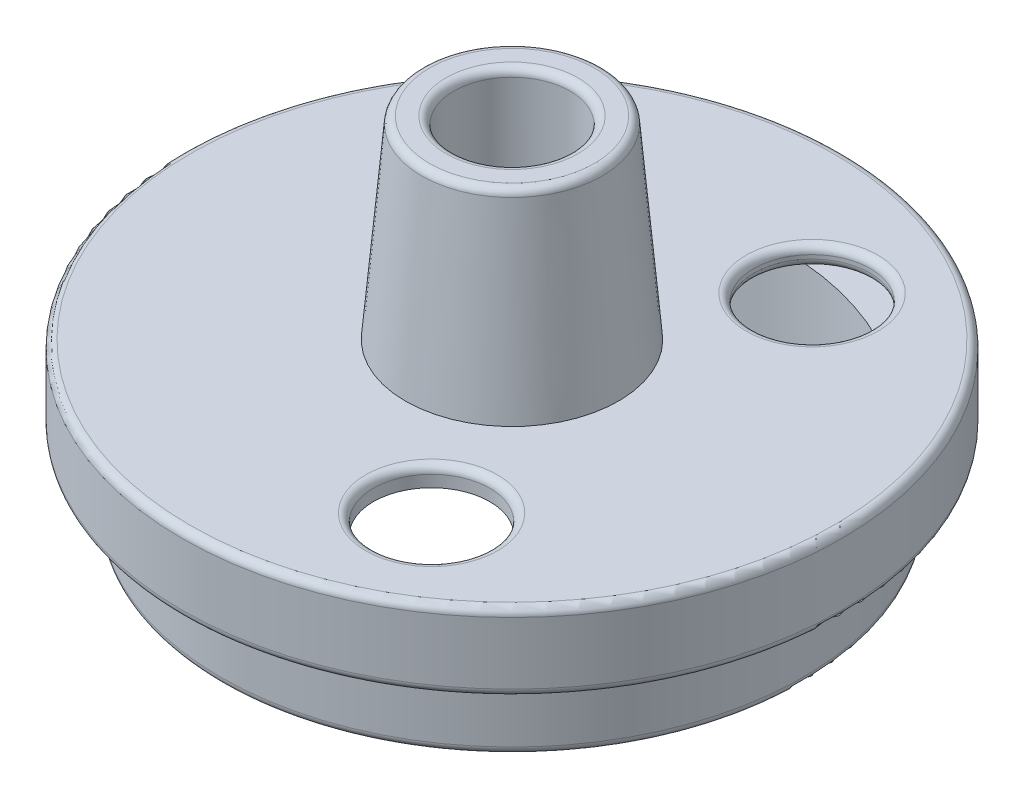
ISO-10303-21;
HEADER;
FILE_DESCRIPTION(('STEP AP214'),'2;1');
FILE_NAME('part.step','',(''),(''),'','','');
FILE_SCHEMA(('AUTOMOTIVE_DESIGN { 1 0 10303 214 1 1 1 1 }'));
ENDSEC;
DATA;
#1=APPLICATION_CONTEXT('core data for automotive mechanical design processes');
#2=APPLICATION_PROTOCOL_DEFINITION('international standard','automotive_design',2000,#1);
#3=PRODUCT_CONTEXT('',#1,'mechanical');
#4=PRODUCT('Part','Part','',(#3));
#5=PRODUCT_RELATED_PRODUCT_CATEGORY('part','',(#4));
#6=PRODUCT_DEFINITION_FORMATION('','',#4);
#7=PRODUCT_DEFINITION_CONTEXT('part definition',#1,'design');
#8=PRODUCT_DEFINITION('design','',#6,#7);
#9=PRODUCT_DEFINITION_SHAPE('','',#8);
#10=(LENGTH_UNIT() NAMED_UNIT(*) SI_UNIT(.MILLI.,.METRE.));
#11=(NAMED_UNIT(*) PLANE_ANGLE_UNIT() SI_UNIT($,.RADIAN.));
#12=(NAMED_UNIT(*) SI_UNIT($,.STERADIAN.) SOLID_ANGLE_UNIT());
#13=UNCERTAINTY_MEASURE_WITH_UNIT(LENGTH_MEASURE(1.E-05),#10,'distance_accuracy_value','');
#14=(GEOMETRIC_REPRESENTATION_CONTEXT(3) GLOBAL_UNCERTAINTY_ASSIGNED_CONTEXT((#13)) GLOBAL_UNIT_ASSIGNED_CONTEXT((#10,
#11,#12)) REPRESENTATION_CONTEXT('',''));
#15=CARTESIAN_POINT('',(0.,0.,0.));
#16=DIRECTION('',(0.,0.,1.));
#17=DIRECTION('',(1.,0.,0.));
#18=AXIS2_PLACEMENT_3D('',#15,#16,#17);
#19=CARTESIAN_POINT('',(0.,0.,0.));
#20=DIRECTION('',(0.,1.,0.));
#21=DIRECTION('',(0.,0.,1.));
#22=AXIS2_PLACEMENT_3D('',#19,#20,#21);
#23=PLANE('',#22);
#24=CARTESIAN_POINT('',(2.83333333333334,0.,4.90747728811181));
#25=DIRECTION('',(0.,1.,0.));
#26=DIRECTION('',(0.,0.,1.));
#27=AXIS2_PLACEMENT_3D('',#24,#25,#26);
#28=CIRCLE('',#27,1.7);
#29=CARTESIAN_POINT('',(2.83333333333334,0.,6.60747728811181));
#30=VERTEX_POINT('',#29);
#31=EDGE_CURVE('E83',#30,#30,#28,.F.);
#32=ORIENTED_EDGE('',*,*,#31,.T.);
#33=EDGE_LOOP('',(#32));
#34=FACE_BOUND('',#33,.T.);
#35=CARTESIAN_POINT('',(2.8333333333333,0.,-4.90747728811184));
#36=DIRECTION('',(0.,1.,0.));
#37=DIRECTION('',(0.,0.,1.));
#38=AXIS2_PLACEMENT_3D('',#35,#36,#37);
#39=CIRCLE('',#38,1.7);
#40=CARTESIAN_POINT('',(2.8333333333333,0.,-3.20747728811184));
#41=VERTEX_POINT('',#40);
#42=EDGE_CURVE('E86',#41,#41,#39,.F.);
#43=ORIENTED_EDGE('',*,*,#42,.T.);
#44=EDGE_LOOP('',(#43));
#45=FACE_BOUND('',#44,.T.);
#46=CARTESIAN_POINT('',(0.,0.,0.));
#47=DIRECTION('',(0.,1.,0.));
#48=DIRECTION('',(0.,0.,1.));
#49=AXIS2_PLACEMENT_3D('',#46,#47,#48);
#50=CIRCLE('',#49,8.3);
#51=CARTESIAN_POINT('',(0.,0.,8.3));
#52=VERTEX_POINT('',#51);
#53=EDGE_CURVE('E89',#52,#52,#50,.T.);
#54=ORIENTED_EDGE('',*,*,#53,.T.);
#55=EDGE_LOOP('',(#54));
#56=FACE_BOUND('',#55,.T.);
#57=CARTESIAN_POINT('',(0.,0.,0.));
#58=DIRECTION('',(0.,1.,0.));
#59=DIRECTION('',(0.,0.,1.));
#60=AXIS2_PLACEMENT_3D('',#57,#58,#59);
#61=CIRCLE('',#60,2.75);
#62=CARTESIAN_POINT('',(0.,0.,2.75));
#63=VERTEX_POINT('',#62);
#64=EDGE_CURVE('E113',#63,#63,#61,.T.);
#65=ORIENTED_EDGE('',*,*,#64,.F.);
#66=EDGE_LOOP('',(#65));
#67=FACE_BOUND('',#66,.T.);
#68=ADVANCED_FACE('F33',(#34,#45,#56,#67),#23,.T.);
#69=CARTESIAN_POINT('',(0.,0.,0.));
#70=DIRECTION('',(0.,1.,0.));
#71=DIRECTION('',(0.,0.,1.));
#72=AXIS2_PLACEMENT_3D('',#69,#70,#71);
#73=CYLINDRICAL_SURFACE('',#72,8.5);
#74=CARTESIAN_POINT('',(0.,-1.8,0.));
#75=DIRECTION('',(0.,-1.,0.));
#76=DIRECTION('',(0.,0.,-1.));
#77=AXIS2_PLACEMENT_3D('',#74,#75,#76);
#78=CIRCLE('',#77,8.5);
#79=CARTESIAN_POINT('',(0.,-1.8,-8.5));
#80=VERTEX_POINT('',#79);
#81=EDGE_CURVE('E65',#80,#80,#78,.F.);
#82=ORIENTED_EDGE('',*,*,#81,.T.);
#83=EDGE_LOOP('',(#82));
#84=FACE_BOUND('',#83,.T.);
#85=CARTESIAN_POINT('',(0.,-0.2,0.));
#86=DIRECTION('',(0.,1.,0.));
#87=DIRECTION('',(0.,0.,1.));
#88=AXIS2_PLACEMENT_3D('',#85,#86,#87);
#89=CIRCLE('',#88,8.5);
#90=CARTESIAN_POINT('',(0.,-0.200000000000001,8.5));
#91=VERTEX_POINT('',#90);
#92=EDGE_CURVE('E68',#91,#91,#89,.F.);
#93=ORIENTED_EDGE('',*,*,#92,.T.);
#94=EDGE_LOOP('',(#93));
#95=FACE_BOUND('',#94,.T.);
#96=ADVANCED_FACE('F120',(#84,#95),#73,.T.);
#97=CARTESIAN_POINT('',(0.,-2.,8.5));
#98=DIRECTION('',(0.,-1.,0.));
#99=DIRECTION('',(0.,0.,-1.));
#100=AXIS2_PLACEMENT_3D('',#97,#98,#99);
#101=PLANE('',#100);
#102=CARTESIAN_POINT('',(0.,-2.,0.));
#103=DIRECTION('',(0.,-1.,0.));
#104=DIRECTION('',(0.,0.,-1.));
#105=AXIS2_PLACEMENT_3D('',#102,#103,#104);
#106=CIRCLE('',#105,8.3);
#107=CARTESIAN_POINT('',(0.,-2.,-8.3));
#108=VERTEX_POINT('',#107);
#109=EDGE_CURVE('E62',#108,#108,#106,.T.);
#110=ORIENTED_EDGE('',*,*,#109,.T.);
#111=EDGE_LOOP('',(#110));
#112=FACE_BOUND('',#111,.T.);
#113=CARTESIAN_POINT('',(0.,-2.,0.));
#114=DIRECTION('',(0.,1.,0.));
#115=DIRECTION('',(0.,0.,1.));
#116=AXIS2_PLACEMENT_3D('',#113,#114,#115);
#117=CIRCLE('',#116,7.5);
#118=CARTESIAN_POINT('',(0.,-2.,7.5));
#119=VERTEX_POINT('',#118);
#120=EDGE_CURVE('E95',#119,#119,#117,.T.);
#121=ORIENTED_EDGE('',*,*,#120,.T.);
#122=EDGE_LOOP('',(#121));
#123=FACE_BOUND('',#122,.T.);
#124=ADVANCED_FACE('F126',(#112,#123),#101,.T.);
#125=CARTESIAN_POINT('',(0.,0.,0.));
#126=DIRECTION('',(0.,1.,0.));
#127=DIRECTION('',(0.,0.,1.));
#128=AXIS2_PLACEMENT_3D('',#125,#126,#127);
#129=CYLINDRICAL_SURFACE('',#128,7.5);
#130=CARTESIAN_POINT('',(0.,-3.8,0.));
#131=DIRECTION('',(0.,-1.,0.));
#132=DIRECTION('',(0.,0.,-1.));
#133=AXIS2_PLACEMENT_3D('',#130,#131,#132);
#134=CIRCLE('',#133,7.5);
#135=CARTESIAN_POINT('',(0.,-3.8,-7.5));
#136=VERTEX_POINT('',#135);
#137=EDGE_CURVE('E71',#136,#136,#134,.F.);
#138=ORIENTED_EDGE('',*,*,#137,.T.);
#139=EDGE_LOOP('',(#138));
#140=FACE_BOUND('',#139,.T.);
#141=ORIENTED_EDGE('',*,*,#120,.F.);
#142=EDGE_LOOP('',(#141));
#143=FACE_BOUND('',#142,.T.);
#144=ADVANCED_FACE('F208',(#140,#143),#129,.T.);
#145=CARTESIAN_POINT('',(0.,-4.,7.));
#146=DIRECTION('',(0.,-1.,0.));
#147=DIRECTION('',(0.,0.,-1.));
#148=AXIS2_PLACEMENT_3D('',#145,#146,#147);
#149=PLANE('',#148);
#150=CARTESIAN_POINT('',(0.,-4.,0.));
#151=DIRECTION('',(0.,-1.,0.));
#152=DIRECTION('',(0.,0.,-1.));
#153=AXIS2_PLACEMENT_3D('',#150,#151,#152);
#154=CIRCLE('',#153,7.2);
#155=CARTESIAN_POINT('',(0.,-4.,-7.2));
#156=VERTEX_POINT('',#155);
#157=EDGE_CURVE('E77',#156,#156,#154,.F.);
#158=ORIENTED_EDGE('',*,*,#157,.T.);
#159=EDGE_LOOP('',(#158));
#160=FACE_BOUND('',#159,.T.);
#161=CARTESIAN_POINT('',(0.,-4.,0.));
#162=DIRECTION('',(0.,-1.,0.));
#163=DIRECTION('',(0.,0.,-1.));
#164=AXIS2_PLACEMENT_3D('',#161,#162,#163);
#165=CIRCLE('',#164,7.3);
#166=CARTESIAN_POINT('',(0.,-4.,-7.3));
#167=VERTEX_POINT('',#166);
#168=EDGE_CURVE('E80',#167,#167,#165,.T.);
#169=ORIENTED_EDGE('',*,*,#168,.T.);
#170=EDGE_LOOP('',(#169));
#171=FACE_BOUND('',#170,.T.);
#172=ADVANCED_FACE('F204',(#160,#171),#149,.T.);
#173=CARTESIAN_POINT('',(0.,0.,0.));
#174=DIRECTION('',(0.,1.,0.));
#175=DIRECTION('',(0.,0.,1.));
#176=AXIS2_PLACEMENT_3D('',#173,#174,#175);
#177=CYLINDRICAL_SURFACE('',#176,7.);
#178=CARTESIAN_POINT('',(0.,-3.8,0.));
#179=DIRECTION('',(0.,-1.,0.));
#180=DIRECTION('',(0.,0.,-1.));
#181=AXIS2_PLACEMENT_3D('',#178,#179,#180);
#182=CIRCLE('',#181,7.);
#183=CARTESIAN_POINT('',(0.,-3.8,-7.));
#184=VERTEX_POINT('',#183);
#185=EDGE_CURVE('E74',#184,#184,#182,.T.);
#186=ORIENTED_EDGE('',*,*,#185,.T.);
#187=EDGE_LOOP('',(#186));
#188=FACE_BOUND('',#187,.T.);
#189=CARTESIAN_POINT('',(0.,-1.5,0.));
#190=DIRECTION('',(0.,1.,0.));
#191=DIRECTION('',(0.,0.,1.));
#192=AXIS2_PLACEMENT_3D('',#189,#190,#191);
#193=CIRCLE('',#192,7.);
#194=CARTESIAN_POINT('',(0.,-1.5,7.));
#195=VERTEX_POINT('',#194);
#196=EDGE_CURVE('E98',#195,#195,#193,.T.);
#197=ORIENTED_EDGE('',*,*,#196,.T.);
#198=EDGE_LOOP('',(#197));
#199=FACE_BOUND('',#198,.T.);
#200=ADVANCED_FACE('F200',(#188,#199),#177,.F.);
#201=CARTESIAN_POINT('',(0.,-1.5,8.));
#202=DIRECTION('',(0.,1.,0.));
#203=DIRECTION('',(0.,0.,1.));
#204=AXIS2_PLACEMENT_3D('',#201,#202,#203);
#205=PLANE('',#204);
#206=CARTESIAN_POINT('',(0.,-1.5,0.));
#207=DIRECTION('',(0.,1.,0.));
#208=DIRECTION('',(0.,0.,1.));
#209=AXIS2_PLACEMENT_3D('',#206,#207,#208);
#210=CIRCLE('',#209,8.);
#211=CARTESIAN_POINT('',(0.,-1.5,8.));
#212=VERTEX_POINT('',#211);
#213=EDGE_CURVE('E101',#212,#212,#210,.T.);
#214=ORIENTED_EDGE('',*,*,#213,.T.);
#215=EDGE_LOOP('',(#214));
#216=FACE_BOUND('',#215,.T.);
#217=ORIENTED_EDGE('',*,*,#196,.F.);
#218=EDGE_LOOP('',(#217));
#219=FACE_BOUND('',#218,.T.);
#220=ADVANCED_FACE('F196',(#216,#219),#205,.T.);
#221=CARTESIAN_POINT('',(0.,0.,0.));
#222=DIRECTION('',(0.,1.,0.));
#223=DIRECTION('',(0.,0.,1.));
#224=AXIS2_PLACEMENT_3D('',#221,#222,#223);
#225=CYLINDRICAL_SURFACE('',#224,8.);
#226=CARTESIAN_POINT('',(0.,-0.5,0.));
#227=DIRECTION('',(0.,1.,0.));
#228=DIRECTION('',(0.,0.,1.));
#229=AXIS2_PLACEMENT_3D('',#226,#227,#228);
#230=CIRCLE('',#229,8.);
#231=CARTESIAN_POINT('',(0.,-0.500000000000001,8.));
#232=VERTEX_POINT('',#231);
#233=EDGE_CURVE('E104',#232,#232,#230,.T.);
#234=ORIENTED_EDGE('',*,*,#233,.T.);
#235=EDGE_LOOP('',(#234));
#236=FACE_BOUND('',#235,.T.);
#237=ORIENTED_EDGE('',*,*,#213,.F.);
#238=EDGE_LOOP('',(#237));
#239=FACE_BOUND('',#238,.T.);
#240=ADVANCED_FACE('F192',(#236,#239),#225,.F.);
#241=CARTESIAN_POINT('',(0.,-0.5,0.));
#242=DIRECTION('',(0.,-1.,0.));
#243=DIRECTION('',(0.,0.,-1.));
#244=AXIS2_PLACEMENT_3D('',#241,#242,#243);
#245=PLANE('',#244);
#246=CARTESIAN_POINT('',(2.8333333333333,-0.499999999999999,-4.90747728811184));
#247=DIRECTION('',(0.,-1.,0.));
#248=DIRECTION('',(0.,0.,-1.));
#249=AXIS2_PLACEMENT_3D('',#246,#247,#248);
#250=CIRCLE('',#249,1.7);
#251=CARTESIAN_POINT('',(2.8333333333333,-0.499999999999999,-6.60747728811184));
#252=VERTEX_POINT('',#251);
#253=EDGE_CURVE('E59',#252,#252,#250,.F.);
#254=ORIENTED_EDGE('',*,*,#253,.T.);
#255=EDGE_LOOP('',(#254));
#256=FACE_BOUND('',#255,.T.);
#257=CARTESIAN_POINT('',(2.83333333333334,-0.5,4.90747728811181));
#258=DIRECTION('',(0.,-1.,0.));
#259=DIRECTION('',(0.,0.,-1.));
#260=AXIS2_PLACEMENT_3D('',#257,#258,#259);
#261=CIRCLE('',#260,1.5);
#262=CARTESIAN_POINT('',(2.83333333333334,-0.5,3.40747728811181));
#263=VERTEX_POINT('',#262);
#264=EDGE_CURVE('E110',#263,#263,#261,.F.);
#265=ORIENTED_EDGE('',*,*,#264,.T.);
#266=EDGE_LOOP('',(#265));
#267=FACE_BOUND('',#266,.T.);
#268=CARTESIAN_POINT('',(0.,-0.5,0.));
#269=DIRECTION('',(0.,-1.,0.));
#270=DIRECTION('',(0.,0.,-1.));
#271=AXIS2_PLACEMENT_3D('',#268,#269,#270);
#272=CIRCLE('',#271,1.5);
#273=CARTESIAN_POINT('',(0.,-0.5,-1.5));
#274=VERTEX_POINT('',#273);
#275=EDGE_CURVE('E107',#274,#274,#272,.F.);
#276=ORIENTED_EDGE('',*,*,#275,.T.);
#277=EDGE_LOOP('',(#276));
#278=FACE_BOUND('',#277,.T.);
#279=ORIENTED_EDGE('',*,*,#233,.F.);
#280=EDGE_LOOP('',(#279));
#281=FACE_BOUND('',#280,.T.);
#282=ADVANCED_FACE('F188',(#256,#267,#278,#281),#245,.T.);
#283=CARTESIAN_POINT('',(2.8333333333333,-4.001,-4.90747728811184));
#284=DIRECTION('',(0.,1.,0.));
#285=DIRECTION('',(0.,0.,1.));
#286=AXIS2_PLACEMENT_3D('',#283,#284,#285);
#287=CYLINDRICAL_SURFACE('',#286,1.5);
#288=CARTESIAN_POINT('',(2.8333333333333,-0.299999999999999,-4.90747728811184));
#289=DIRECTION('',(0.,-1.,0.));
#290=DIRECTION('',(0.,0.,-1.));
#291=AXIS2_PLACEMENT_3D('',#288,#289,#290);
#292=CIRCLE('',#291,1.5);
#293=CARTESIAN_POINT('',(2.8333333333333,-0.299999999999999,-6.40747728811184));
#294=VERTEX_POINT('',#293);
#295=EDGE_CURVE('E53',#294,#294,#292,.T.);
#296=ORIENTED_EDGE('',*,*,#295,.T.);
#297=EDGE_LOOP('',(#296));
#298=FACE_BOUND('',#297,.T.);
#299=CARTESIAN_POINT('',(2.8333333333333,-0.2,-4.90747728811184));
#300=DIRECTION('',(0.,1.,0.));
#301=DIRECTION('',(0.,0.,1.));
#302=AXIS2_PLACEMENT_3D('',#299,#300,#301);
#303=CIRCLE('',#302,1.5);
#304=CARTESIAN_POINT('',(2.8333333333333,-0.2,-3.40747728811184));
#305=VERTEX_POINT('',#304);
#306=EDGE_CURVE('E56',#305,#305,#303,.T.);
#307=ORIENTED_EDGE('',*,*,#306,.T.);
#308=EDGE_LOOP('',(#307));
#309=FACE_BOUND('',#308,.T.);
#310=ADVANCED_FACE('F185',(#298,#309),#287,.F.);
#311=CARTESIAN_POINT('',(0.,-4.001,0.));
#312=DIRECTION('',(0.,1.,0.));
#313=DIRECTION('',(0.,0.,1.));
#314=AXIS2_PLACEMENT_3D('',#311,#312,#313);
#315=CYLINDRICAL_SURFACE('',#314,1.5);
#316=CARTESIAN_POINT('',(0.,4.8,0.));
#317=DIRECTION('',(0.,1.,0.));
#318=DIRECTION('',(0.,0.,1.));
#319=AXIS2_PLACEMENT_3D('',#316,#317,#318);
#320=CIRCLE('',#319,1.5);
#321=CARTESIAN_POINT('',(0.,4.8,1.5));
#322=VERTEX_POINT('',#321);
#323=EDGE_CURVE('E10',#322,#322,#320,.T.);
#324=ORIENTED_EDGE('',*,*,#323,.T.);
#325=EDGE_LOOP('',(#324));
#326=FACE_BOUND('',#325,.T.);
#327=ORIENTED_EDGE('',*,*,#275,.F.);
#328=EDGE_LOOP('',(#327));
#329=FACE_BOUND('',#328,.T.);
#330=ADVANCED_FACE('F179',(#326,#329),#315,.F.);
#331=CARTESIAN_POINT('',(2.83333333333334,-4.001,4.90747728811181));
#332=DIRECTION('',(0.,1.,0.));
#333=DIRECTION('',(0.,0.,1.));
#334=AXIS2_PLACEMENT_3D('',#331,#332,#333);
#335=CYLINDRICAL_SURFACE('',#334,1.5);
#336=CARTESIAN_POINT('',(2.83333333333334,-0.200000000000001,4.90747728811181));
#337=DIRECTION('',(0.,1.,0.));
#338=DIRECTION('',(0.,0.,1.));
#339=AXIS2_PLACEMENT_3D('',#336,#337,#338);
#340=CIRCLE('',#339,1.5);
#341=CARTESIAN_POINT('',(2.83333333333334,-0.200000000000001,6.40747728811181));
#342=VERTEX_POINT('',#341);
#343=EDGE_CURVE('E92',#342,#342,#340,.T.);
#344=ORIENTED_EDGE('',*,*,#343,.T.);
#345=EDGE_LOOP('',(#344));
#346=FACE_BOUND('',#345,.T.);
#347=ORIENTED_EDGE('',*,*,#264,.F.);
#348=EDGE_LOOP('',(#347));
#349=FACE_BOUND('',#348,.T.);
#350=ADVANCED_FACE('F173',(#346,#349),#335,.F.);
#351=CARTESIAN_POINT('',(0.,5.,0.));
#352=DIRECTION('',(0.,1.,0.));
#353=DIRECTION('',(0.,0.,1.));
#354=AXIS2_PLACEMENT_3D('',#351,#352,#353);
#355=PLANE('',#354);
#356=CARTESIAN_POINT('',(0.,5.,0.));
#357=DIRECTION('',(0.,1.,0.));
#358=DIRECTION('',(0.,0.,1.));
#359=AXIS2_PLACEMENT_3D('',#356,#357,#358);
#360=CIRCLE('',#359,2.12929044756689);
#361=CARTESIAN_POINT('',(0.,5.,2.12929044756689));
#362=VERTEX_POINT('',#361);
#363=EDGE_CURVE('E44',#362,#362,#360,.T.);
#364=ORIENTED_EDGE('',*,*,#363,.T.);
#365=EDGE_LOOP('',(#364));
#366=FACE_BOUND('',#365,.T.);
#367=CARTESIAN_POINT('',(0.,5.,0.));
#368=DIRECTION('',(0.,1.,0.));
#369=DIRECTION('',(0.,0.,1.));
#370=AXIS2_PLACEMENT_3D('',#367,#368,#369);
#371=CIRCLE('',#370,1.7);
#372=CARTESIAN_POINT('',(0.,5.,1.7));
#373=VERTEX_POINT('',#372);
#374=EDGE_CURVE('E48',#373,#373,#371,.F.);
#375=ORIENTED_EDGE('',*,*,#374,.T.);
#376=EDGE_LOOP('',(#375));
#377=FACE_BOUND('',#376,.T.);
#378=ADVANCED_FACE('F135',(#366,#377),#355,.T.);
#379=CARTESIAN_POINT('',(0.,0.,0.));
#380=DIRECTION('',(0.,-1.,0.));
#381=DIRECTION('',(0.,0.,1.));
#382=AXIS2_PLACEMENT_3D('',#379,#380,#381);
#383=CONICAL_SURFACE('',#382,2.75,0.0872664625997165);
#384=CARTESIAN_POINT('',(0.,4.81743114854953,0.));
#385=DIRECTION('',(0.,-1.,0.));
#386=DIRECTION('',(0.,0.,-1.));
#387=AXIS2_PLACEMENT_3D('',#384,#385,#386);
#388=CIRCLE('',#387,2.32852938718524);
#389=CARTESIAN_POINT('',(0.,4.81743114854953,-2.32852938718524));
#390=VERTEX_POINT('',#389);
#391=EDGE_CURVE('E40',#390,#390,#388,.T.);
#392=ORIENTED_EDGE('',*,*,#391,.T.);
#393=EDGE_LOOP('',(#392));
#394=FACE_BOUND('',#393,.T.);
#395=ORIENTED_EDGE('',*,*,#64,.T.);
#396=EDGE_LOOP('',(#395));
#397=FACE_BOUND('',#396,.T.);
#398=ADVANCED_FACE('F117',(#394,#397),#383,.T.);
#399=CARTESIAN_POINT('',(2.83333333333334,-0.200000000000001,4.90747728811181));
#400=DIRECTION('',(0.,1.,0.));
#401=DIRECTION('',(0.,0.,1.));
#402=AXIS2_PLACEMENT_3D('',#399,#400,#401);
#403=TOROIDAL_SURFACE('',#402,1.7,0.2);
#404=ORIENTED_EDGE('',*,*,#31,.F.);
#405=EDGE_LOOP('',(#404));
#406=FACE_BOUND('',#405,.T.);
#407=ORIENTED_EDGE('',*,*,#343,.F.);
#408=EDGE_LOOP('',(#407));
#409=FACE_BOUND('',#408,.T.);
#410=ADVANCED_FACE('F134',(#406,#409),#403,.T.);
#411=CARTESIAN_POINT('',(0.,-3.8,0.));
#412=DIRECTION('',(0.,-1.,0.));
#413=DIRECTION('',(0.,0.,-1.));
#414=AXIS2_PLACEMENT_3D('',#411,#412,#413);
#415=TOROIDAL_SURFACE('',#414,7.2,0.2);
#416=ORIENTED_EDGE('',*,*,#185,.F.);
#417=EDGE_LOOP('',(#416));
#418=FACE_BOUND('',#417,.T.);
#419=ORIENTED_EDGE('',*,*,#157,.F.);
#420=EDGE_LOOP('',(#419));
#421=FACE_BOUND('',#420,.T.);
#422=ADVANCED_FACE('F138',(#418,#421),#415,.T.);
#423=CARTESIAN_POINT('',(0.,-3.8,0.));
#424=DIRECTION('',(0.,-1.,0.));
#425=DIRECTION('',(0.,0.,-1.));
#426=AXIS2_PLACEMENT_3D('',#423,#424,#425);
#427=TOROIDAL_SURFACE('',#426,7.3,0.2);
#428=ORIENTED_EDGE('',*,*,#168,.F.);
#429=EDGE_LOOP('',(#428));
#430=FACE_BOUND('',#429,.T.);
#431=ORIENTED_EDGE('',*,*,#137,.F.);
#432=EDGE_LOOP('',(#431));
#433=FACE_BOUND('',#432,.T.);
#434=ADVANCED_FACE('F142',(#430,#433),#427,.T.);
#435=CARTESIAN_POINT('',(0.,-1.8,0.));
#436=DIRECTION('',(0.,-1.,0.));
#437=DIRECTION('',(0.,0.,-1.));
#438=AXIS2_PLACEMENT_3D('',#435,#436,#437);
#439=TOROIDAL_SURFACE('',#438,8.3,0.2);
#440=ORIENTED_EDGE('',*,*,#109,.F.);
#441=EDGE_LOOP('',(#440));
#442=FACE_BOUND('',#441,.T.);
#443=ORIENTED_EDGE('',*,*,#81,.F.);
#444=EDGE_LOOP('',(#443));
#445=FACE_BOUND('',#444,.T.);
#446=ADVANCED_FACE('F146',(#442,#445),#439,.T.);
#447=CARTESIAN_POINT('',(2.8333333333333,-0.299999999999999,-4.90747728811184));
#448=DIRECTION('',(0.,-1.,0.));
#449=DIRECTION('',(0.,0.,-1.));
#450=AXIS2_PLACEMENT_3D('',#447,#448,#449);
#451=TOROIDAL_SURFACE('',#450,1.7,0.2);
#452=ORIENTED_EDGE('',*,*,#295,.F.);
#453=EDGE_LOOP('',(#452));
#454=FACE_BOUND('',#453,.T.);
#455=ORIENTED_EDGE('',*,*,#253,.F.);
#456=EDGE_LOOP('',(#455));
#457=FACE_BOUND('',#456,.T.);
#458=ADVANCED_FACE('F150',(#454,#457),#451,.T.);
#459=CARTESIAN_POINT('',(2.8333333333333,-0.2,-4.90747728811184));
#460=DIRECTION('',(0.,1.,0.));
#461=DIRECTION('',(0.,0.,1.));
#462=AXIS2_PLACEMENT_3D('',#459,#460,#461);
#463=TOROIDAL_SURFACE('',#462,1.7,0.2);
#464=ORIENTED_EDGE('',*,*,#42,.F.);
#465=EDGE_LOOP('',(#464));
#466=FACE_BOUND('',#465,.T.);
#467=ORIENTED_EDGE('',*,*,#306,.F.);
#468=EDGE_LOOP('',(#467));
#469=FACE_BOUND('',#468,.T.);
#470=ADVANCED_FACE('F154',(#466,#469),#463,.T.);
#471=CARTESIAN_POINT('',(0.,4.8,0.));
#472=DIRECTION('',(0.,1.,0.));
#473=DIRECTION('',(0.,0.,1.));
#474=AXIS2_PLACEMENT_3D('',#471,#472,#473);
#475=TOROIDAL_SURFACE('',#474,2.12929044756689,0.2);
#476=ORIENTED_EDGE('',*,*,#391,.F.);
#477=EDGE_LOOP('',(#476));
#478=FACE_BOUND('',#477,.T.);
#479=ORIENTED_EDGE('',*,*,#363,.F.);
#480=EDGE_LOOP('',(#479));
#481=FACE_BOUND('',#480,.T.);
#482=ADVANCED_FACE('F158',(#478,#481),#475,.T.);
#483=CARTESIAN_POINT('',(0.,4.8,0.));
#484=DIRECTION('',(0.,1.,0.));
#485=DIRECTION('',(0.,0.,1.));
#486=AXIS2_PLACEMENT_3D('',#483,#484,#485);
#487=TOROIDAL_SURFACE('',#486,1.7,0.2);
#488=ORIENTED_EDGE('',*,*,#374,.F.);
#489=EDGE_LOOP('',(#488));
#490=FACE_BOUND('',#489,.T.);
#491=ORIENTED_EDGE('',*,*,#323,.F.);
#492=EDGE_LOOP('',(#491));
#493=FACE_BOUND('',#492,.T.);
#494=ADVANCED_FACE('F161',(#490,#493),#487,.T.);
#495=CARTESIAN_POINT('',(0.,-0.2,0.));
#496=DIRECTION('',(0.,1.,0.));
#497=DIRECTION('',(0.,0.,1.));
#498=AXIS2_PLACEMENT_3D('',#495,#496,#497);
#499=TOROIDAL_SURFACE('',#498,8.3,0.2);
#500=ORIENTED_EDGE('',*,*,#92,.F.);
#501=EDGE_LOOP('',(#500));
#502=FACE_BOUND('',#501,.T.);
#503=ORIENTED_EDGE('',*,*,#53,.F.);
#504=EDGE_LOOP('',(#503));
#505=FACE_BOUND('',#504,.T.);
#506=ADVANCED_FACE('F35',(#502,#505),#499,.T.);
#507=CLOSED_SHELL('',(#68,#96,#124,#144,#172,#200,#220,#240,#282,#310,#330,#350,#378,#398,#410,
#422,#434,#446,#458,#470,#482,#494,#506));
#508=MANIFOLD_SOLID_BREP('B2',#507);
#509=ADVANCED_BREP_SHAPE_REPRESENTATION('',(#18,#508),#14);
#510=SHAPE_DEFINITION_REPRESENTATION(#9,#509);
ENDSEC;
END-ISO-10303-21;
